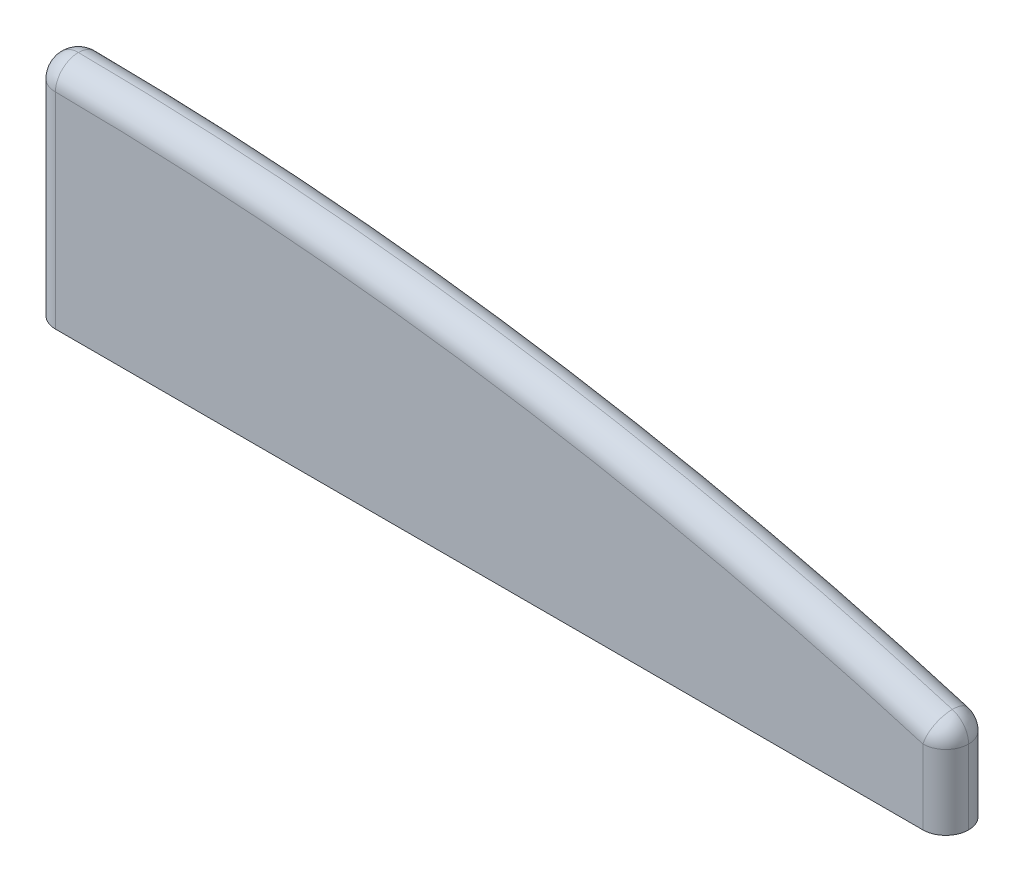
ISO-10303-21;
HEADER;
FILE_DESCRIPTION(('STEP AP214'),'2;1');
FILE_NAME('part.step','',(''),(''),'','','');
FILE_SCHEMA(('AUTOMOTIVE_DESIGN { 1 0 10303 214 1 1 1 1 }'));
ENDSEC;
DATA;
#1=APPLICATION_CONTEXT('core data for automotive mechanical design processes');
#2=APPLICATION_PROTOCOL_DEFINITION('international standard','automotive_design',2000,#1);
#3=PRODUCT_CONTEXT('',#1,'mechanical');
#4=PRODUCT('Part','Part','',(#3));
#5=PRODUCT_RELATED_PRODUCT_CATEGORY('part','',(#4));
#6=PRODUCT_DEFINITION_FORMATION('','',#4);
#7=PRODUCT_DEFINITION_CONTEXT('part definition',#1,'design');
#8=PRODUCT_DEFINITION('design','',#6,#7);
#9=PRODUCT_DEFINITION_SHAPE('','',#8);
#10=(LENGTH_UNIT() NAMED_UNIT(*) SI_UNIT(.MILLI.,.METRE.));
#11=(NAMED_UNIT(*) PLANE_ANGLE_UNIT() SI_UNIT($,.RADIAN.));
#12=(NAMED_UNIT(*) SI_UNIT($,.STERADIAN.) SOLID_ANGLE_UNIT());
#13=UNCERTAINTY_MEASURE_WITH_UNIT(LENGTH_MEASURE(1.E-05),#10,'distance_accuracy_value','');
#14=(GEOMETRIC_REPRESENTATION_CONTEXT(3) GLOBAL_UNCERTAINTY_ASSIGNED_CONTEXT((#13)) GLOBAL_UNIT_ASSIGNED_CONTEXT((#10,
#11,#12)) REPRESENTATION_CONTEXT('',''));
#15=CARTESIAN_POINT('',(0.,0.,0.));
#16=DIRECTION('',(0.,0.,1.));
#17=DIRECTION('',(1.,0.,0.));
#18=AXIS2_PLACEMENT_3D('',#15,#16,#17);
#19=CARTESIAN_POINT('',(0.,0.,1.));
#20=DIRECTION('',(0.,1.,0.));
#21=DIRECTION('',(0.,0.,1.));
#22=AXIS2_PLACEMENT_3D('',#19,#20,#21);
#23=PLANE('',#22);
#24=DIRECTION('',(1.,0.,0.));
#25=VECTOR('',#24,1.);
#26=CARTESIAN_POINT('',(0.,0.,1.));
#27=LINE('',#26,#25);
#28=CARTESIAN_POINT('',(0.5,0.,1.));
#29=VERTEX_POINT('',#28);
#30=CARTESIAN_POINT('',(19.5,0.,1.));
#31=VERTEX_POINT('',#30);
#32=EDGE_CURVE('E108',#29,#31,#27,.T.);
#33=ORIENTED_EDGE('',*,*,#32,.F.);
#34=CARTESIAN_POINT('',(0.5,0.,0.5));
#35=DIRECTION('',(0.,1.,0.));
#36=DIRECTION('',(0.,0.,1.));
#37=AXIS2_PLACEMENT_3D('',#34,#35,#36);
#38=CIRCLE('',#37,0.5);
#39=CARTESIAN_POINT('',(0.,0.,0.5));
#40=VERTEX_POINT('',#39);
#41=EDGE_CURVE('E83',#29,#40,#38,.F.);
#42=ORIENTED_EDGE('',*,*,#41,.T.);
#43=CARTESIAN_POINT('',(0.5,0.,0.5));
#44=DIRECTION('',(0.,1.,0.));
#45=DIRECTION('',(0.,0.,1.));
#46=AXIS2_PLACEMENT_3D('',#43,#44,#45);
#47=CIRCLE('',#46,0.5);
#48=CARTESIAN_POINT('',(0.5,0.,0.));
#49=VERTEX_POINT('',#48);
#50=EDGE_CURVE('E105',#40,#49,#47,.F.);
#51=ORIENTED_EDGE('',*,*,#50,.T.);
#52=DIRECTION('',(1.,0.,0.));
#53=VECTOR('',#52,1.);
#54=CARTESIAN_POINT('',(0.,0.,0.));
#55=LINE('',#54,#53);
#56=CARTESIAN_POINT('',(19.5,0.,0.));
#57=VERTEX_POINT('',#56);
#58=EDGE_CURVE('E153',#49,#57,#55,.T.);
#59=ORIENTED_EDGE('',*,*,#58,.T.);
#60=CARTESIAN_POINT('',(19.5,0.,0.5));
#61=DIRECTION('',(0.,1.,0.));
#62=DIRECTION('',(0.,0.,1.));
#63=AXIS2_PLACEMENT_3D('',#60,#61,#62);
#64=CIRCLE('',#63,0.5);
#65=CARTESIAN_POINT('',(20.,0.,0.5));
#66=VERTEX_POINT('',#65);
#67=EDGE_CURVE('E123',#57,#66,#64,.F.);
#68=ORIENTED_EDGE('',*,*,#67,.T.);
#69=CARTESIAN_POINT('',(19.5,0.,0.5));
#70=DIRECTION('',(0.,1.,0.));
#71=DIRECTION('',(0.,0.,1.));
#72=AXIS2_PLACEMENT_3D('',#69,#70,#71);
#73=CIRCLE('',#72,0.5);
#74=EDGE_CURVE('E125',#66,#31,#73,.F.);
#75=ORIENTED_EDGE('',*,*,#74,.T.);
#76=EDGE_LOOP('',(#33,#42,#51,#59,#68,#75));
#77=FACE_BOUND('',#76,.T.);
#78=ADVANCED_FACE('F33',(#77),#23,.F.);
#79=CARTESIAN_POINT('',(0.,-63.1666666666667,1.));
#80=DIRECTION('',(0.,0.,-1.));
#81=DIRECTION('',(-1.,0.,0.));
#82=AXIS2_PLACEMENT_3D('',#79,#80,#81);
#83=PLANE('',#82);
#84=CARTESIAN_POINT('',(0.,-63.1666666666667,1.));
#85=DIRECTION('',(0.,0.,-1.));
#86=DIRECTION('',(-1.,0.,0.));
#87=AXIS2_PLACEMENT_3D('',#84,#85,#86);
#88=CIRCLE('',#87,67.6666666666667);
#89=CARTESIAN_POINT('',(19.5,1.62938088083253,1.));
#90=VERTEX_POINT('',#89);
#91=CARTESIAN_POINT('',(0.5,4.49815268414352,1.));
#92=VERTEX_POINT('',#91);
#93=EDGE_CURVE('E158',#90,#92,#88,.F.);
#94=ORIENTED_EDGE('',*,*,#93,.T.);
#95=DIRECTION('',(0.,-1.,0.));
#96=VECTOR('',#95,1.);
#97=CARTESIAN_POINT('',(0.5,-63.1666666666667,1.));
#98=LINE('',#97,#96);
#99=EDGE_CURVE('E164',#92,#29,#98,.T.);
#100=ORIENTED_EDGE('',*,*,#99,.T.);
#101=ORIENTED_EDGE('',*,*,#32,.T.);
#102=DIRECTION('',(0.,1.,0.));
#103=VECTOR('',#102,1.);
#104=CARTESIAN_POINT('',(19.5000000000001,-63.1666666666666,1.));
#105=LINE('',#104,#103);
#106=EDGE_CURVE('E162',#31,#90,#105,.T.);
#107=ORIENTED_EDGE('',*,*,#106,.T.);
#108=EDGE_LOOP('',(#94,#100,#101,#107));
#109=FACE_BOUND('',#108,.T.);
#110=ADVANCED_FACE('F167',(#109),#83,.F.);
#111=CARTESIAN_POINT('',(0.,-63.1666666666667,0.));
#112=DIRECTION('',(0.,0.,-1.));
#113=DIRECTION('',(-1.,0.,0.));
#114=AXIS2_PLACEMENT_3D('',#111,#112,#113);
#115=PLANE('',#114);
#116=ORIENTED_EDGE('',*,*,#58,.F.);
#117=DIRECTION('',(0.,-1.,0.));
#118=VECTOR('',#117,1.);
#119=CARTESIAN_POINT('',(0.5,5.,0.));
#120=LINE('',#119,#118);
#121=CARTESIAN_POINT('',(0.5,4.49815268414352,0.));
#122=VERTEX_POINT('',#121);
#123=EDGE_CURVE('E11',#49,#122,#120,.F.);
#124=ORIENTED_EDGE('',*,*,#123,.T.);
#125=CARTESIAN_POINT('',(0.,-63.1666666666667,0.));
#126=DIRECTION('',(0.,0.,-1.));
#127=DIRECTION('',(-1.,0.,0.));
#128=AXIS2_PLACEMENT_3D('',#125,#126,#127);
#129=CIRCLE('',#128,67.6666666666667);
#130=CARTESIAN_POINT('',(19.5,1.62938088083253,0.));
#131=VERTEX_POINT('',#130);
#132=EDGE_CURVE('E51',#122,#131,#129,.T.);
#133=ORIENTED_EDGE('',*,*,#132,.T.);
#134=DIRECTION('',(0.,1.,0.));
#135=VECTOR('',#134,1.);
#136=CARTESIAN_POINT('',(19.5,0.,0.));
#137=LINE('',#136,#135);
#138=EDGE_CURVE('E43',#131,#57,#137,.F.);
#139=ORIENTED_EDGE('',*,*,#138,.T.);
#140=EDGE_LOOP('',(#116,#124,#133,#139));
#141=FACE_BOUND('',#140,.T.);
#142=ADVANCED_FACE('F185',(#141),#115,.T.);
#143=CARTESIAN_POINT('',(19.5000000000001,-63.1666666666666,0.5));
#144=DIRECTION('',(0.,1.,0.));
#145=DIRECTION('',(-1.,0.,0.));
#146=AXIS2_PLACEMENT_3D('',#143,#144,#145);
#147=CYLINDRICAL_SURFACE('',#146,0.5);
#148=ORIENTED_EDGE('',*,*,#106,.F.);
#149=ORIENTED_EDGE('',*,*,#74,.F.);
#150=DIRECTION('',(0.,1.,0.));
#151=VECTOR('',#150,1.);
#152=CARTESIAN_POINT('',(20.,0.,0.5));
#153=LINE('',#152,#151);
#154=CARTESIAN_POINT('',(20.,1.62938088083253,0.5));
#155=VERTEX_POINT('',#154);
#156=EDGE_CURVE('E37',#155,#66,#153,.F.);
#157=ORIENTED_EDGE('',*,*,#156,.F.);
#158=CARTESIAN_POINT('',(19.5,1.62938088083253,0.5));
#159=DIRECTION('',(0.,1.,0.));
#160=DIRECTION('',(-1.,0.,0.));
#161=AXIS2_PLACEMENT_3D('',#158,#159,#160);
#162=CIRCLE('',#161,0.5);
#163=EDGE_CURVE('E152',#90,#155,#162,.T.);
#164=ORIENTED_EDGE('',*,*,#163,.F.);
#165=EDGE_LOOP('',(#148,#149,#157,#164));
#166=FACE_BOUND('',#165,.T.);
#167=ADVANCED_FACE('F35',(#166),#147,.T.);
#168=CARTESIAN_POINT('',(19.5,0.,0.5));
#169=DIRECTION('',(0.,-1.,0.));
#170=DIRECTION('',(1.,0.,0.));
#171=AXIS2_PLACEMENT_3D('',#168,#169,#170);
#172=CYLINDRICAL_SURFACE('',#171,0.5);
#173=CARTESIAN_POINT('',(19.5,1.62938088083253,0.5));
#174=DIRECTION('',(0.,1.,0.));
#175=DIRECTION('',(0.,0.,1.));
#176=AXIS2_PLACEMENT_3D('',#173,#174,#175);
#177=CIRCLE('',#176,0.5);
#178=EDGE_CURVE('E150',#155,#131,#177,.T.);
#179=ORIENTED_EDGE('',*,*,#178,.F.);
#180=ORIENTED_EDGE('',*,*,#156,.T.);
#181=ORIENTED_EDGE('',*,*,#67,.F.);
#182=ORIENTED_EDGE('',*,*,#138,.F.);
#183=EDGE_LOOP('',(#179,#180,#181,#182));
#184=FACE_BOUND('',#183,.T.);
#185=ADVANCED_FACE('F184',(#184),#172,.T.);
#186=CARTESIAN_POINT('',(19.5,1.62938088083255,0.5));
#187=DIRECTION('',(0.,0.,1.));
#188=DIRECTION('',(1.,0.,0.));
#189=AXIS2_PLACEMENT_3D('',#186,#187,#188);
#190=SPHERICAL_SURFACE('',#189,0.5);
#191=ORIENTED_EDGE('',*,*,#163,.T.);
#192=CARTESIAN_POINT('',(19.5,1.62938088083254,0.5));
#193=DIRECTION('',(0.,0.,-1.));
#194=DIRECTION('',(-1.,0.,0.));
#195=AXIS2_PLACEMENT_3D('',#192,#193,#194);
#196=CIRCLE('',#195,0.5);
#197=CARTESIAN_POINT('',(19.6440886699507,2.10816940950864,0.5));
#198=VERTEX_POINT('',#197);
#199=EDGE_CURVE('E68',#198,#155,#196,.T.);
#200=ORIENTED_EDGE('',*,*,#199,.F.);
#201=CARTESIAN_POINT('',(19.5,1.62938088083254,0.5));
#202=DIRECTION('',(0.957577057352206,-0.288177339901476,0.));
#203=DIRECTION('',(0.288177339901476,0.957577057352206,0.));
#204=AXIS2_PLACEMENT_3D('',#201,#202,#203);
#205=CIRCLE('',#204,0.5);
#206=EDGE_CURVE('E118',#90,#198,#205,.F.);
#207=ORIENTED_EDGE('',*,*,#206,.F.);
#208=EDGE_LOOP('',(#191,#200,#207));
#209=FACE_BOUND('',#208,.T.);
#210=ADVANCED_FACE('F169',(#209),#190,.T.);
#211=CARTESIAN_POINT('',(19.5,1.62938088083255,0.5));
#212=DIRECTION('',(0.,0.,1.));
#213=DIRECTION('',(1.,0.,0.));
#214=AXIS2_PLACEMENT_3D('',#211,#212,#213);
#215=SPHERICAL_SURFACE('',#214,0.5);
#216=ORIENTED_EDGE('',*,*,#199,.T.);
#217=ORIENTED_EDGE('',*,*,#178,.T.);
#218=CARTESIAN_POINT('',(19.5,1.62938088083253,0.5));
#219=DIRECTION('',(0.957577057352203,-0.288177339901484,0.));
#220=DIRECTION('',(0.288177339901484,0.957577057352203,0.));
#221=AXIS2_PLACEMENT_3D('',#218,#219,#220);
#222=CIRCLE('',#221,0.5);
#223=EDGE_CURVE('E119',#198,#131,#222,.F.);
#224=ORIENTED_EDGE('',*,*,#223,.F.);
#225=EDGE_LOOP('',(#216,#217,#224));
#226=FACE_BOUND('',#225,.T.);
#227=ADVANCED_FACE('F183',(#226),#215,.T.);
#228=CARTESIAN_POINT('',(0.,-63.1666666666667,0.5));
#229=DIRECTION('',(0.,0.,-1.));
#230=DIRECTION('',(-1.,0.,0.));
#231=AXIS2_PLACEMENT_3D('',#228,#229,#230);
#232=TOROIDAL_SURFACE('',#231,67.6666666666667,0.5);
#233=ORIENTED_EDGE('',*,*,#93,.F.);
#234=ORIENTED_EDGE('',*,*,#206,.T.);
#235=CARTESIAN_POINT('',(0.,-63.1666666666667,0.5));
#236=DIRECTION('',(0.,0.,-1.));
#237=DIRECTION('',(-1.,0.,0.));
#238=AXIS2_PLACEMENT_3D('',#235,#236,#237);
#239=CIRCLE('',#238,68.1666666666667);
#240=CARTESIAN_POINT('',(0.503694581280788,4.99813903402636,0.5));
#241=VERTEX_POINT('',#240);
#242=EDGE_CURVE('E143',#241,#198,#239,.T.);
#243=ORIENTED_EDGE('',*,*,#242,.F.);
#244=CARTESIAN_POINT('',(0.5,4.49815268414352,0.5));
#245=DIRECTION('',(-0.999972699765668,0.0073891625615763,0.));
#246=DIRECTION('',(-0.0073891625615763,-0.999972699765668,0.));
#247=AXIS2_PLACEMENT_3D('',#244,#245,#246);
#248=CIRCLE('',#247,0.5);
#249=EDGE_CURVE('E140',#92,#241,#248,.T.);
#250=ORIENTED_EDGE('',*,*,#249,.F.);
#251=EDGE_LOOP('',(#233,#234,#243,#250));
#252=FACE_BOUND('',#251,.T.);
#253=ADVANCED_FACE('F173',(#252),#232,.T.);
#254=CARTESIAN_POINT('',(0.5,-63.1666666666667,0.5));
#255=DIRECTION('',(0.,-1.,0.));
#256=DIRECTION('',(0.,0.,-1.));
#257=AXIS2_PLACEMENT_3D('',#254,#255,#256);
#258=CYLINDRICAL_SURFACE('',#257,0.5);
#259=DIRECTION('',(0.,-1.,0.));
#260=VECTOR('',#259,1.);
#261=CARTESIAN_POINT('',(0.,0.,0.5));
#262=LINE('',#261,#260);
#263=CARTESIAN_POINT('',(0.,4.49815268414354,0.5));
#264=VERTEX_POINT('',#263);
#265=EDGE_CURVE('E111',#40,#264,#262,.F.);
#266=ORIENTED_EDGE('',*,*,#265,.F.);
#267=ORIENTED_EDGE('',*,*,#41,.F.);
#268=ORIENTED_EDGE('',*,*,#99,.F.);
#269=CARTESIAN_POINT('',(0.5,4.49815268414354,0.5));
#270=DIRECTION('',(0.,1.,0.));
#271=DIRECTION('',(0.,0.,1.));
#272=AXIS2_PLACEMENT_3D('',#269,#270,#271);
#273=CIRCLE('',#272,0.5);
#274=EDGE_CURVE('E114',#264,#92,#273,.T.);
#275=ORIENTED_EDGE('',*,*,#274,.F.);
#276=EDGE_LOOP('',(#266,#267,#268,#275));
#277=FACE_BOUND('',#276,.T.);
#278=ADVANCED_FACE('F112',(#277),#258,.T.);
#279=CARTESIAN_POINT('',(0.5,0.,0.5));
#280=DIRECTION('',(0.,1.,0.));
#281=DIRECTION('',(0.,0.,1.));
#282=AXIS2_PLACEMENT_3D('',#279,#280,#281);
#283=CYLINDRICAL_SURFACE('',#282,0.5);
#284=ORIENTED_EDGE('',*,*,#50,.F.);
#285=ORIENTED_EDGE('',*,*,#265,.T.);
#286=CARTESIAN_POINT('',(0.5,4.49815268414353,0.5));
#287=DIRECTION('',(0.,1.,0.));
#288=DIRECTION('',(-1.,0.,0.));
#289=AXIS2_PLACEMENT_3D('',#286,#287,#288);
#290=CIRCLE('',#289,0.5);
#291=EDGE_CURVE('E137',#122,#264,#290,.T.);
#292=ORIENTED_EDGE('',*,*,#291,.F.);
#293=ORIENTED_EDGE('',*,*,#123,.F.);
#294=EDGE_LOOP('',(#284,#285,#292,#293));
#295=FACE_BOUND('',#294,.T.);
#296=ADVANCED_FACE('F122',(#295),#283,.T.);
#297=CARTESIAN_POINT('',(0.,-63.1666666666667,0.5));
#298=DIRECTION('',(0.,0.,-1.));
#299=DIRECTION('',(-1.,0.,0.));
#300=AXIS2_PLACEMENT_3D('',#297,#298,#299);
#301=TOROIDAL_SURFACE('',#300,67.6666666666667,0.5);
#302=ORIENTED_EDGE('',*,*,#223,.T.);
#303=ORIENTED_EDGE('',*,*,#132,.F.);
#304=CARTESIAN_POINT('',(0.5,4.49815268414353,0.5));
#305=DIRECTION('',(-0.999972699765668,0.00738916256157641,0.));
#306=DIRECTION('',(-0.00738916256157641,-0.999972699765668,0.));
#307=AXIS2_PLACEMENT_3D('',#304,#305,#306);
#308=CIRCLE('',#307,0.5);
#309=EDGE_CURVE('E134',#241,#122,#308,.T.);
#310=ORIENTED_EDGE('',*,*,#309,.F.);
#311=ORIENTED_EDGE('',*,*,#242,.T.);
#312=EDGE_LOOP('',(#302,#303,#310,#311));
#313=FACE_BOUND('',#312,.T.);
#314=ADVANCED_FACE('F181',(#313),#301,.T.);
#315=CARTESIAN_POINT('',(0.5,4.49815268414353,0.5));
#316=DIRECTION('',(0.,0.,1.));
#317=DIRECTION('',(1.,0.,0.));
#318=AXIS2_PLACEMENT_3D('',#315,#316,#317);
#319=SPHERICAL_SURFACE('',#318,0.5);
#320=ORIENTED_EDGE('',*,*,#274,.T.);
#321=ORIENTED_EDGE('',*,*,#249,.T.);
#322=CARTESIAN_POINT('',(0.5,4.49815268414353,0.5));
#323=DIRECTION('',(0.,0.,1.));
#324=DIRECTION('',(1.,0.,0.));
#325=AXIS2_PLACEMENT_3D('',#322,#323,#324);
#326=CIRCLE('',#325,0.5);
#327=EDGE_CURVE('E131',#264,#241,#326,.F.);
#328=ORIENTED_EDGE('',*,*,#327,.F.);
#329=EDGE_LOOP('',(#320,#321,#328));
#330=FACE_BOUND('',#329,.T.);
#331=ADVANCED_FACE('F177',(#330),#319,.T.);
#332=CARTESIAN_POINT('',(0.5,4.49815268414352,0.5));
#333=DIRECTION('',(0.,0.,1.));
#334=DIRECTION('',(1.,0.,0.));
#335=AXIS2_PLACEMENT_3D('',#332,#333,#334);
#336=SPHERICAL_SURFACE('',#335,0.5);
#337=ORIENTED_EDGE('',*,*,#309,.T.);
#338=ORIENTED_EDGE('',*,*,#291,.T.);
#339=ORIENTED_EDGE('',*,*,#327,.T.);
#340=EDGE_LOOP('',(#337,#338,#339));
#341=FACE_BOUND('',#340,.T.);
#342=ADVANCED_FACE('F179',(#341),#336,.T.);
#343=CLOSED_SHELL('',(#78,#110,#142,#167,#185,#210,#227,#253,#278,#296,#314,#331,#342));
#344=MANIFOLD_SOLID_BREP('B2',#343);
#345=ADVANCED_BREP_SHAPE_REPRESENTATION('',(#18,#344),#14);
#346=SHAPE_DEFINITION_REPRESENTATION(#9,#345);
ENDSEC;
END-ISO-10303-21;
